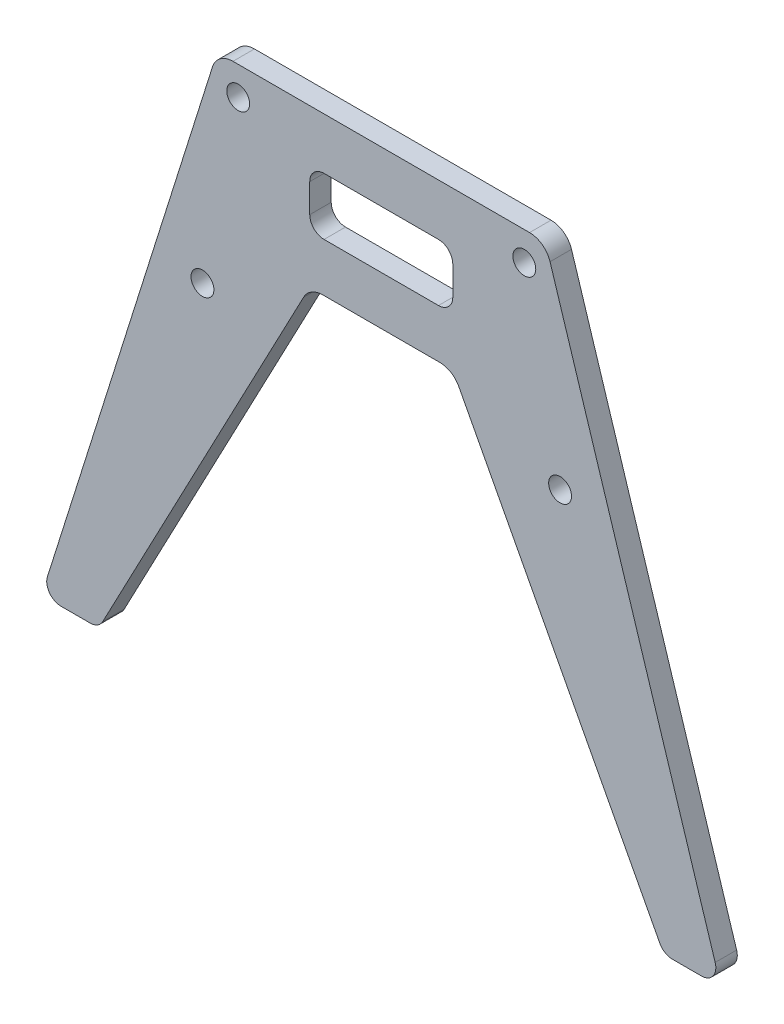
ISO-10303-21;
HEADER;
FILE_DESCRIPTION(('STEP AP214'),'2;1');
FILE_NAME('part.step','',(''),(''),'','','');
FILE_SCHEMA(('AUTOMOTIVE_DESIGN { 1 0 10303 214 1 1 1 1 }'));
ENDSEC;
DATA;
#1=APPLICATION_CONTEXT('core data for automotive mechanical design processes');
#2=APPLICATION_PROTOCOL_DEFINITION('international standard','automotive_design',2000,#1);
#3=PRODUCT_CONTEXT('',#1,'mechanical');
#4=PRODUCT('Part','Part','',(#3));
#5=PRODUCT_RELATED_PRODUCT_CATEGORY('part','',(#4));
#6=PRODUCT_DEFINITION_FORMATION('','',#4);
#7=PRODUCT_DEFINITION_CONTEXT('part definition',#1,'design');
#8=PRODUCT_DEFINITION('design','',#6,#7);
#9=PRODUCT_DEFINITION_SHAPE('','',#8);
#10=(LENGTH_UNIT() NAMED_UNIT(*) SI_UNIT(.MILLI.,.METRE.));
#11=(NAMED_UNIT(*) PLANE_ANGLE_UNIT() SI_UNIT($,.RADIAN.));
#12=(NAMED_UNIT(*) SI_UNIT($,.STERADIAN.) SOLID_ANGLE_UNIT());
#13=UNCERTAINTY_MEASURE_WITH_UNIT(LENGTH_MEASURE(1.E-05),#10,'distance_accuracy_value','');
#14=(GEOMETRIC_REPRESENTATION_CONTEXT(3) GLOBAL_UNCERTAINTY_ASSIGNED_CONTEXT((#13)) GLOBAL_UNIT_ASSIGNED_CONTEXT((#10,
#11,#12)) REPRESENTATION_CONTEXT('',''));
#15=CARTESIAN_POINT('',(0.,0.,0.));
#16=DIRECTION('',(0.,0.,1.));
#17=DIRECTION('',(1.,0.,0.));
#18=AXIS2_PLACEMENT_3D('',#15,#16,#17);
#19=CARTESIAN_POINT('',(0.,0.,3.));
#20=DIRECTION('',(0.,0.,-1.));
#21=DIRECTION('',(-1.,0.,0.));
#22=AXIS2_PLACEMENT_3D('',#19,#20,#21);
#23=PLANE('',#22);
#24=CARTESIAN_POINT('',(-25.,-11.,3.));
#25=DIRECTION('',(0.,0.,1.));
#26=DIRECTION('',(1.,0.,0.));
#27=AXIS2_PLACEMENT_3D('',#24,#25,#26);
#28=CIRCLE('',#27,1.6);
#29=CARTESIAN_POINT('',(-23.4,-11.,3.));
#30=VERTEX_POINT('',#29);
#31=EDGE_CURVE('E522',#30,#30,#28,.T.);
#32=ORIENTED_EDGE('',*,*,#31,.F.);
#33=EDGE_LOOP('',(#32));
#34=FACE_BOUND('',#33,.T.);
#35=CARTESIAN_POINT('',(25.,-11.,3.));
#36=DIRECTION('',(0.,0.,1.));
#37=DIRECTION('',(1.,0.,0.));
#38=AXIS2_PLACEMENT_3D('',#35,#36,#37);
#39=CIRCLE('',#38,1.6);
#40=CARTESIAN_POINT('',(26.6,-11.,3.));
#41=VERTEX_POINT('',#40);
#42=EDGE_CURVE('E523',#41,#41,#39,.T.);
#43=ORIENTED_EDGE('',*,*,#42,.F.);
#44=EDGE_LOOP('',(#43));
#45=FACE_BOUND('',#44,.T.);
#46=DIRECTION('',(1.,0.,0.));
#47=VECTOR('',#46,1.);
#48=CARTESIAN_POINT('',(-10.,2.8,3.));
#49=LINE('',#48,#47);
#50=CARTESIAN_POINT('',(-8.,2.8,3.));
#51=VERTEX_POINT('',#50);
#52=CARTESIAN_POINT('',(8.,2.8,3.));
#53=VERTEX_POINT('',#52);
#54=EDGE_CURVE('E387',#51,#53,#49,.T.);
#55=ORIENTED_EDGE('',*,*,#54,.F.);
#56=CARTESIAN_POINT('',(-8.,4.8,3.));
#57=DIRECTION('',(0.,0.,-1.));
#58=DIRECTION('',(-1.,0.,0.));
#59=AXIS2_PLACEMENT_3D('',#56,#57,#58);
#60=CIRCLE('',#59,2.);
#61=CARTESIAN_POINT('',(-10.,4.8,3.));
#62=VERTEX_POINT('',#61);
#63=EDGE_CURVE('E349',#51,#62,#60,.T.);
#64=ORIENTED_EDGE('',*,*,#63,.T.);
#65=DIRECTION('',(0.,-1.,0.));
#66=VECTOR('',#65,1.);
#67=CARTESIAN_POINT('',(-10.,10.8,3.));
#68=LINE('',#67,#66);
#69=CARTESIAN_POINT('',(-10.,8.8,3.));
#70=VERTEX_POINT('',#69);
#71=EDGE_CURVE('E359',#70,#62,#68,.T.);
#72=ORIENTED_EDGE('',*,*,#71,.F.);
#73=CARTESIAN_POINT('',(-8.,8.8,3.));
#74=DIRECTION('',(0.,0.,-1.));
#75=DIRECTION('',(-1.,0.,0.));
#76=AXIS2_PLACEMENT_3D('',#73,#74,#75);
#77=CIRCLE('',#76,2.);
#78=CARTESIAN_POINT('',(-8.,10.8,3.));
#79=VERTEX_POINT('',#78);
#80=EDGE_CURVE('E49',#70,#79,#77,.T.);
#81=ORIENTED_EDGE('',*,*,#80,.T.);
#82=DIRECTION('',(-1.,0.,0.));
#83=VECTOR('',#82,1.);
#84=CARTESIAN_POINT('',(-10.,10.8,3.));
#85=LINE('',#84,#83);
#86=CARTESIAN_POINT('',(8.,10.8,3.));
#87=VERTEX_POINT('',#86);
#88=EDGE_CURVE('E358',#87,#79,#85,.T.);
#89=ORIENTED_EDGE('',*,*,#88,.F.);
#90=CARTESIAN_POINT('',(8.,8.8,3.));
#91=DIRECTION('',(0.,0.,-1.));
#92=DIRECTION('',(-1.,0.,0.));
#93=AXIS2_PLACEMENT_3D('',#90,#91,#92);
#94=CIRCLE('',#93,2.);
#95=CARTESIAN_POINT('',(10.,8.8,3.));
#96=VERTEX_POINT('',#95);
#97=EDGE_CURVE('E341',#87,#96,#94,.T.);
#98=ORIENTED_EDGE('',*,*,#97,.T.);
#99=DIRECTION('',(0.,1.,0.));
#100=VECTOR('',#99,1.);
#101=CARTESIAN_POINT('',(10.,10.8,3.));
#102=LINE('',#101,#100);
#103=CARTESIAN_POINT('',(10.,4.8,3.));
#104=VERTEX_POINT('',#103);
#105=EDGE_CURVE('E368',#104,#96,#102,.T.);
#106=ORIENTED_EDGE('',*,*,#105,.F.);
#107=CARTESIAN_POINT('',(8.,4.8,3.));
#108=DIRECTION('',(0.,0.,-1.));
#109=DIRECTION('',(-1.,0.,0.));
#110=AXIS2_PLACEMENT_3D('',#107,#108,#109);
#111=CIRCLE('',#110,2.);
#112=EDGE_CURVE('E345',#104,#53,#111,.T.);
#113=ORIENTED_EDGE('',*,*,#112,.T.);
#114=EDGE_LOOP('',(#55,#64,#72,#81,#89,#98,#106,#113));
#115=FACE_BOUND('',#114,.T.);
#116=DIRECTION('',(1.,0.,0.));
#117=VECTOR('',#116,1.);
#118=CARTESIAN_POINT('',(47.5,-60.,3.));
#119=LINE('',#118,#117);
#120=CARTESIAN_POINT('',(40.7069623037807,-60.,3.));
#121=VERTEX_POINT('',#120);
#122=CARTESIAN_POINT('',(44.7732513123354,-60.,3.));
#123=VERTEX_POINT('',#122);
#124=EDGE_CURVE('E414',#121,#123,#119,.T.);
#125=ORIENTED_EDGE('',*,*,#124,.T.);
#126=CARTESIAN_POINT('',(44.7732513123354,-58.,3.));
#127=DIRECTION('',(0.,0.,-1.));
#128=DIRECTION('',(-1.,0.,0.));
#129=AXIS2_PLACEMENT_3D('',#126,#127,#128);
#130=CIRCLE('',#129,2.);
#131=CARTESIAN_POINT('',(46.6808759142368,-57.3991935601042,3.));
#132=VERTEX_POINT('',#131);
#133=EDGE_CURVE('E289',#123,#132,#130,.F.);
#134=ORIENTED_EDGE('',*,*,#133,.T.);
#135=DIRECTION('',(-0.300403219947907,0.953812300950732,0.));
#136=VECTOR('',#135,1.);
#137=CARTESIAN_POINT('',(22.933897075367,18.,3.));
#138=LINE('',#137,#136);
#139=CARTESIAN_POINT('',(23.5949111716939,15.9012096598437,3.));
#140=VERTEX_POINT('',#139);
#141=EDGE_CURVE('E238',#132,#140,#138,.T.);
#142=ORIENTED_EDGE('',*,*,#141,.T.);
#143=CARTESIAN_POINT('',(20.7334742688417,15.,3.));
#144=DIRECTION('',(0.,0.,-1.));
#145=DIRECTION('',(-1.,0.,0.));
#146=AXIS2_PLACEMENT_3D('',#143,#144,#145);
#147=CIRCLE('',#146,3.);
#148=CARTESIAN_POINT('',(20.7334742688417,18.,3.));
#149=VERTEX_POINT('',#148);
#150=EDGE_CURVE('E261',#140,#149,#147,.F.);
#151=ORIENTED_EDGE('',*,*,#150,.T.);
#152=DIRECTION('',(-1.,0.,0.));
#153=VECTOR('',#152,1.);
#154=CARTESIAN_POINT('',(-22.933897075367,18.,3.));
#155=LINE('',#154,#153);
#156=CARTESIAN_POINT('',(-20.7334742688418,18.,3.));
#157=VERTEX_POINT('',#156);
#158=EDGE_CURVE('E222',#149,#157,#155,.T.);
#159=ORIENTED_EDGE('',*,*,#158,.T.);
#160=CARTESIAN_POINT('',(-20.7334742688418,15.,3.));
#161=DIRECTION('',(0.,0.,-1.));
#162=DIRECTION('',(-1.,0.,0.));
#163=AXIS2_PLACEMENT_3D('',#160,#161,#162);
#164=CIRCLE('',#163,3.);
#165=CARTESIAN_POINT('',(-23.594911171694,15.9012096598437,3.));
#166=VERTEX_POINT('',#165);
#167=EDGE_CURVE('E259',#157,#166,#164,.F.);
#168=ORIENTED_EDGE('',*,*,#167,.T.);
#169=DIRECTION('',(-0.300403219947907,-0.953812300950732,0.));
#170=VECTOR('',#169,1.);
#171=CARTESIAN_POINT('',(-22.933897075367,18.,3.));
#172=LINE('',#171,#170);
#173=CARTESIAN_POINT('',(-46.6808759142368,-57.3991935601042,3.));
#174=VERTEX_POINT('',#173);
#175=EDGE_CURVE('E401',#166,#174,#172,.T.);
#176=ORIENTED_EDGE('',*,*,#175,.T.);
#177=CARTESIAN_POINT('',(-44.7732513123354,-58.,3.));
#178=DIRECTION('',(0.,0.,-1.));
#179=DIRECTION('',(-1.,0.,0.));
#180=AXIS2_PLACEMENT_3D('',#177,#178,#179);
#181=CIRCLE('',#180,2.);
#182=CARTESIAN_POINT('',(-44.7732513123354,-60.,3.));
#183=VERTEX_POINT('',#182);
#184=EDGE_CURVE('E283',#174,#183,#181,.F.);
#185=ORIENTED_EDGE('',*,*,#184,.T.);
#186=DIRECTION('',(1.,0.,0.));
#187=VECTOR('',#186,1.);
#188=CARTESIAN_POINT('',(-47.5,-60.,3.));
#189=LINE('',#188,#187);
#190=CARTESIAN_POINT('',(-40.7069623037807,-60.,3.));
#191=VERTEX_POINT('',#190);
#192=EDGE_CURVE('E404',#183,#191,#189,.T.);
#193=ORIENTED_EDGE('',*,*,#192,.T.);
#194=CARTESIAN_POINT('',(-40.7069623037807,-58.,3.));
#195=DIRECTION('',(0.,0.,-1.));
#196=DIRECTION('',(-1.,0.,0.));
#197=AXIS2_PLACEMENT_3D('',#194,#195,#196);
#198=CIRCLE('',#197,2.);
#199=CARTESIAN_POINT('',(-38.937468691386,-58.9321439565294,3.));
#200=VERTEX_POINT('',#199);
#201=EDGE_CURVE('E285',#191,#200,#198,.F.);
#202=ORIENTED_EDGE('',*,*,#201,.T.);
#203=DIRECTION('',(0.466071978264685,0.884746806197368,0.));
#204=VECTOR('',#203,1.);
#205=CARTESIAN_POINT('',(-39.5,-60.,3.));
#206=LINE('',#205,#204);
#207=CARTESIAN_POINT('',(-10.843796962921,-5.60178406520596,3.));
#208=VERTEX_POINT('',#207);
#209=EDGE_CURVE('E407',#200,#208,#206,.T.);
#210=ORIENTED_EDGE('',*,*,#209,.T.);
#211=CARTESIAN_POINT('',(-8.1895565443289,-7.,3.));
#212=DIRECTION('',(0.,0.,-1.));
#213=DIRECTION('',(-1.,0.,0.));
#214=AXIS2_PLACEMENT_3D('',#211,#212,#213);
#215=CIRCLE('',#214,3.);
#216=CARTESIAN_POINT('',(-8.18955654432889,-4.,3.));
#217=VERTEX_POINT('',#216);
#218=EDGE_CURVE('E320',#208,#217,#215,.T.);
#219=ORIENTED_EDGE('',*,*,#218,.T.);
#220=DIRECTION('',(1.,0.,0.));
#221=VECTOR('',#220,1.);
#222=CARTESIAN_POINT('',(10.,-4.00000000000001,3.));
#223=LINE('',#222,#221);
#224=CARTESIAN_POINT('',(8.1895565443289,-4.00000000000001,3.));
#225=VERTEX_POINT('',#224);
#226=EDGE_CURVE('E410',#217,#225,#223,.T.);
#227=ORIENTED_EDGE('',*,*,#226,.T.);
#228=CARTESIAN_POINT('',(8.1895565443289,-7.00000000000001,3.));
#229=DIRECTION('',(0.,0.,-1.));
#230=DIRECTION('',(-1.,0.,0.));
#231=AXIS2_PLACEMENT_3D('',#228,#229,#230);
#232=CIRCLE('',#231,3.);
#233=CARTESIAN_POINT('',(10.843796962921,-5.60178406520595,3.));
#234=VERTEX_POINT('',#233);
#235=EDGE_CURVE('E316',#225,#234,#232,.T.);
#236=ORIENTED_EDGE('',*,*,#235,.T.);
#237=DIRECTION('',(0.466071978264685,-0.884746806197368,0.));
#238=VECTOR('',#237,1.);
#239=CARTESIAN_POINT('',(39.5,-60.,3.));
#240=LINE('',#239,#238);
#241=CARTESIAN_POINT('',(38.937468691386,-58.9321439565294,3.));
#242=VERTEX_POINT('',#241);
#243=EDGE_CURVE('E413',#234,#242,#240,.T.);
#244=ORIENTED_EDGE('',*,*,#243,.T.);
#245=CARTESIAN_POINT('',(40.7069623037807,-58.,3.));
#246=DIRECTION('',(0.,0.,-1.));
#247=DIRECTION('',(-1.,0.,0.));
#248=AXIS2_PLACEMENT_3D('',#245,#246,#247);
#249=CIRCLE('',#248,2.);
#250=EDGE_CURVE('E287',#242,#121,#249,.F.);
#251=ORIENTED_EDGE('',*,*,#250,.T.);
#252=EDGE_LOOP('',(#125,#134,#142,#151,#159,#168,#176,#185,#193,#202,#210,#219,#227,#236,#244,#251));
#253=FACE_BOUND('',#252,.T.);
#254=CARTESIAN_POINT('',(-20.,14.,3.));
#255=DIRECTION('',(0.,0.,1.));
#256=DIRECTION('',(1.,0.,0.));
#257=AXIS2_PLACEMENT_3D('',#254,#255,#256);
#258=CIRCLE('',#257,1.59999999999999);
#259=CARTESIAN_POINT('',(-18.4,14.,3.));
#260=VERTEX_POINT('',#259);
#261=EDGE_CURVE('E229',#260,#260,#258,.T.);
#262=ORIENTED_EDGE('',*,*,#261,.F.);
#263=EDGE_LOOP('',(#262));
#264=FACE_BOUND('',#263,.T.);
#265=CARTESIAN_POINT('',(20.,14.,3.));
#266=DIRECTION('',(0.,0.,1.));
#267=DIRECTION('',(1.,0.,0.));
#268=AXIS2_PLACEMENT_3D('',#265,#266,#267);
#269=CIRCLE('',#268,1.59999999999999);
#270=CARTESIAN_POINT('',(21.6,14.,3.));
#271=VERTEX_POINT('',#270);
#272=EDGE_CURVE('E393',#271,#271,#269,.T.);
#273=ORIENTED_EDGE('',*,*,#272,.F.);
#274=EDGE_LOOP('',(#273));
#275=FACE_BOUND('',#274,.T.);
#276=ADVANCED_FACE('F41',(#34,#45,#115,#253,#264,#275),#23,.F.);
#277=CARTESIAN_POINT('',(0.,0.,0.));
#278=DIRECTION('',(0.,0.,-1.));
#279=DIRECTION('',(-1.,0.,0.));
#280=AXIS2_PLACEMENT_3D('',#277,#278,#279);
#281=PLANE('',#280);
#282=CARTESIAN_POINT('',(-25.,-11.,0.));
#283=DIRECTION('',(0.,0.,1.));
#284=DIRECTION('',(1.,0.,0.));
#285=AXIS2_PLACEMENT_3D('',#282,#283,#284);
#286=CIRCLE('',#285,1.6);
#287=CARTESIAN_POINT('',(-23.4,-11.,0.));
#288=VERTEX_POINT('',#287);
#289=EDGE_CURVE('E388',#288,#288,#286,.T.);
#290=ORIENTED_EDGE('',*,*,#289,.T.);
#291=EDGE_LOOP('',(#290));
#292=FACE_BOUND('',#291,.T.);
#293=CARTESIAN_POINT('',(25.,-11.,0.));
#294=DIRECTION('',(0.,0.,1.));
#295=DIRECTION('',(1.,0.,0.));
#296=AXIS2_PLACEMENT_3D('',#293,#294,#295);
#297=CIRCLE('',#296,1.6);
#298=CARTESIAN_POINT('',(26.6,-11.,0.));
#299=VERTEX_POINT('',#298);
#300=EDGE_CURVE('E378',#299,#299,#297,.T.);
#301=ORIENTED_EDGE('',*,*,#300,.T.);
#302=EDGE_LOOP('',(#301));
#303=FACE_BOUND('',#302,.T.);
#304=DIRECTION('',(-1.,0.,0.));
#305=VECTOR('',#304,1.);
#306=CARTESIAN_POINT('',(-10.,10.8,0.));
#307=LINE('',#306,#305);
#308=CARTESIAN_POINT('',(8.,10.8,0.));
#309=VERTEX_POINT('',#308);
#310=CARTESIAN_POINT('',(-8.,10.8,0.));
#311=VERTEX_POINT('',#310);
#312=EDGE_CURVE('E383',#309,#311,#307,.T.);
#313=ORIENTED_EDGE('',*,*,#312,.T.);
#314=CARTESIAN_POINT('',(-8.,8.8,0.));
#315=DIRECTION('',(0.,0.,-1.));
#316=DIRECTION('',(-1.,0.,0.));
#317=AXIS2_PLACEMENT_3D('',#314,#315,#316);
#318=CIRCLE('',#317,2.);
#319=CARTESIAN_POINT('',(-10.,8.8,0.));
#320=VERTEX_POINT('',#319);
#321=EDGE_CURVE('E11',#311,#320,#318,.F.);
#322=ORIENTED_EDGE('',*,*,#321,.T.);
#323=DIRECTION('',(0.,-1.,0.));
#324=VECTOR('',#323,1.);
#325=CARTESIAN_POINT('',(-10.,10.8,0.));
#326=LINE('',#325,#324);
#327=CARTESIAN_POINT('',(-10.,4.8,0.));
#328=VERTEX_POINT('',#327);
#329=EDGE_CURVE('E367',#320,#328,#326,.T.);
#330=ORIENTED_EDGE('',*,*,#329,.T.);
#331=CARTESIAN_POINT('',(-8.,4.8,0.));
#332=DIRECTION('',(0.,0.,-1.));
#333=DIRECTION('',(-1.,0.,0.));
#334=AXIS2_PLACEMENT_3D('',#331,#332,#333);
#335=CIRCLE('',#334,2.);
#336=CARTESIAN_POINT('',(-8.,2.8,0.));
#337=VERTEX_POINT('',#336);
#338=EDGE_CURVE('E351',#328,#337,#335,.F.);
#339=ORIENTED_EDGE('',*,*,#338,.T.);
#340=DIRECTION('',(1.,0.,0.));
#341=VECTOR('',#340,1.);
#342=CARTESIAN_POINT('',(-10.,2.8,0.));
#343=LINE('',#342,#341);
#344=CARTESIAN_POINT('',(8.,2.8,0.));
#345=VERTEX_POINT('',#344);
#346=EDGE_CURVE('E372',#337,#345,#343,.T.);
#347=ORIENTED_EDGE('',*,*,#346,.T.);
#348=CARTESIAN_POINT('',(8.,4.8,0.));
#349=DIRECTION('',(0.,0.,-1.));
#350=DIRECTION('',(-1.,0.,0.));
#351=AXIS2_PLACEMENT_3D('',#348,#349,#350);
#352=CIRCLE('',#351,2.);
#353=CARTESIAN_POINT('',(10.,4.8,0.));
#354=VERTEX_POINT('',#353);
#355=EDGE_CURVE('E347',#345,#354,#352,.F.);
#356=ORIENTED_EDGE('',*,*,#355,.T.);
#357=DIRECTION('',(0.,1.,0.));
#358=VECTOR('',#357,1.);
#359=CARTESIAN_POINT('',(10.,10.8,0.));
#360=LINE('',#359,#358);
#361=CARTESIAN_POINT('',(10.,8.8,0.));
#362=VERTEX_POINT('',#361);
#363=EDGE_CURVE('E375',#354,#362,#360,.T.);
#364=ORIENTED_EDGE('',*,*,#363,.T.);
#365=CARTESIAN_POINT('',(8.,8.8,0.));
#366=DIRECTION('',(0.,0.,-1.));
#367=DIRECTION('',(-1.,0.,0.));
#368=AXIS2_PLACEMENT_3D('',#365,#366,#367);
#369=CIRCLE('',#368,2.);
#370=EDGE_CURVE('E343',#362,#309,#369,.F.);
#371=ORIENTED_EDGE('',*,*,#370,.T.);
#372=EDGE_LOOP('',(#313,#322,#330,#339,#347,#356,#364,#371));
#373=FACE_BOUND('',#372,.T.);
#374=CARTESIAN_POINT('',(-20.,14.,0.));
#375=DIRECTION('',(0.,0.,1.));
#376=DIRECTION('',(1.,0.,0.));
#377=AXIS2_PLACEMENT_3D('',#374,#375,#376);
#378=CIRCLE('',#377,1.59999999999999);
#379=CARTESIAN_POINT('',(-18.4,14.,0.));
#380=VERTEX_POINT('',#379);
#381=EDGE_CURVE('E235',#380,#380,#378,.T.);
#382=ORIENTED_EDGE('',*,*,#381,.T.);
#383=EDGE_LOOP('',(#382));
#384=FACE_BOUND('',#383,.T.);
#385=DIRECTION('',(-0.300403219947907,0.953812300950732,0.));
#386=VECTOR('',#385,1.);
#387=CARTESIAN_POINT('',(22.933897075367,18.,0.));
#388=LINE('',#387,#386);
#389=CARTESIAN_POINT('',(46.6808759142368,-57.3991935601042,0.));
#390=VERTEX_POINT('',#389);
#391=CARTESIAN_POINT('',(23.5949111716939,15.9012096598437,0.));
#392=VERTEX_POINT('',#391);
#393=EDGE_CURVE('E254',#390,#392,#388,.T.);
#394=ORIENTED_EDGE('',*,*,#393,.F.);
#395=CARTESIAN_POINT('',(44.7732513123354,-58.,0.));
#396=DIRECTION('',(0.,0.,-1.));
#397=DIRECTION('',(-1.,0.,0.));
#398=AXIS2_PLACEMENT_3D('',#395,#396,#397);
#399=CIRCLE('',#398,2.);
#400=CARTESIAN_POINT('',(44.7732513123354,-60.,0.));
#401=VERTEX_POINT('',#400);
#402=EDGE_CURVE('E276',#390,#401,#399,.T.);
#403=ORIENTED_EDGE('',*,*,#402,.T.);
#404=DIRECTION('',(1.,0.,0.));
#405=VECTOR('',#404,1.);
#406=CARTESIAN_POINT('',(47.5,-60.,0.));
#407=LINE('',#406,#405);
#408=CARTESIAN_POINT('',(40.7069623037807,-60.,0.));
#409=VERTEX_POINT('',#408);
#410=EDGE_CURVE('E251',#409,#401,#407,.T.);
#411=ORIENTED_EDGE('',*,*,#410,.F.);
#412=CARTESIAN_POINT('',(40.7069623037807,-58.,0.));
#413=DIRECTION('',(0.,0.,-1.));
#414=DIRECTION('',(-1.,0.,0.));
#415=AXIS2_PLACEMENT_3D('',#412,#413,#414);
#416=CIRCLE('',#415,2.);
#417=CARTESIAN_POINT('',(38.937468691386,-58.9321439565294,0.));
#418=VERTEX_POINT('',#417);
#419=EDGE_CURVE('E273',#409,#418,#416,.T.);
#420=ORIENTED_EDGE('',*,*,#419,.T.);
#421=DIRECTION('',(0.466071978264685,-0.884746806197368,0.));
#422=VECTOR('',#421,1.);
#423=CARTESIAN_POINT('',(39.5,-60.,0.));
#424=LINE('',#423,#422);
#425=CARTESIAN_POINT('',(10.843796962921,-5.60178406520595,0.));
#426=VERTEX_POINT('',#425);
#427=EDGE_CURVE('E249',#426,#418,#424,.T.);
#428=ORIENTED_EDGE('',*,*,#427,.F.);
#429=CARTESIAN_POINT('',(8.1895565443289,-7.00000000000001,0.));
#430=DIRECTION('',(0.,0.,-1.));
#431=DIRECTION('',(-1.,0.,0.));
#432=AXIS2_PLACEMENT_3D('',#429,#430,#431);
#433=CIRCLE('',#432,3.);
#434=CARTESIAN_POINT('',(8.1895565443289,-4.00000000000001,0.));
#435=VERTEX_POINT('',#434);
#436=EDGE_CURVE('E314',#426,#435,#433,.F.);
#437=ORIENTED_EDGE('',*,*,#436,.T.);
#438=DIRECTION('',(1.,0.,0.));
#439=VECTOR('',#438,1.);
#440=CARTESIAN_POINT('',(10.,-4.00000000000001,0.));
#441=LINE('',#440,#439);
#442=CARTESIAN_POINT('',(-8.18955654432889,-4.,0.));
#443=VERTEX_POINT('',#442);
#444=EDGE_CURVE('E246',#443,#435,#441,.T.);
#445=ORIENTED_EDGE('',*,*,#444,.F.);
#446=CARTESIAN_POINT('',(-8.1895565443289,-7.,0.));
#447=DIRECTION('',(0.,0.,-1.));
#448=DIRECTION('',(-1.,0.,0.));
#449=AXIS2_PLACEMENT_3D('',#446,#447,#448);
#450=CIRCLE('',#449,3.);
#451=CARTESIAN_POINT('',(-10.843796962921,-5.60178406520596,0.));
#452=VERTEX_POINT('',#451);
#453=EDGE_CURVE('E318',#443,#452,#450,.F.);
#454=ORIENTED_EDGE('',*,*,#453,.T.);
#455=DIRECTION('',(0.466071978264685,0.884746806197368,0.));
#456=VECTOR('',#455,1.);
#457=CARTESIAN_POINT('',(-39.5,-60.,0.));
#458=LINE('',#457,#456);
#459=CARTESIAN_POINT('',(-38.937468691386,-58.9321439565294,0.));
#460=VERTEX_POINT('',#459);
#461=EDGE_CURVE('E243',#460,#452,#458,.T.);
#462=ORIENTED_EDGE('',*,*,#461,.F.);
#463=CARTESIAN_POINT('',(-40.7069623037807,-58.,0.));
#464=DIRECTION('',(0.,0.,-1.));
#465=DIRECTION('',(-1.,0.,0.));
#466=AXIS2_PLACEMENT_3D('',#463,#464,#465);
#467=CIRCLE('',#466,2.);
#468=CARTESIAN_POINT('',(-40.7069623037807,-60.,0.));
#469=VERTEX_POINT('',#468);
#470=EDGE_CURVE('E271',#460,#469,#467,.T.);
#471=ORIENTED_EDGE('',*,*,#470,.T.);
#472=DIRECTION('',(1.,0.,0.));
#473=VECTOR('',#472,1.);
#474=CARTESIAN_POINT('',(-47.5,-60.,0.));
#475=LINE('',#474,#473);
#476=CARTESIAN_POINT('',(-44.7732513123354,-60.,0.));
#477=VERTEX_POINT('',#476);
#478=EDGE_CURVE('E232',#477,#469,#475,.T.);
#479=ORIENTED_EDGE('',*,*,#478,.F.);
#480=CARTESIAN_POINT('',(-44.7732513123354,-58.,0.));
#481=DIRECTION('',(0.,0.,-1.));
#482=DIRECTION('',(-1.,0.,0.));
#483=AXIS2_PLACEMENT_3D('',#480,#481,#482);
#484=CIRCLE('',#483,2.);
#485=CARTESIAN_POINT('',(-46.6808759142368,-57.3991935601042,0.));
#486=VERTEX_POINT('',#485);
#487=EDGE_CURVE('E269',#477,#486,#484,.T.);
#488=ORIENTED_EDGE('',*,*,#487,.T.);
#489=DIRECTION('',(-0.300403219947907,-0.953812300950732,0.));
#490=VECTOR('',#489,1.);
#491=CARTESIAN_POINT('',(-22.933897075367,18.,0.));
#492=LINE('',#491,#490);
#493=CARTESIAN_POINT('',(-23.594911171694,15.9012096598437,0.));
#494=VERTEX_POINT('',#493);
#495=EDGE_CURVE('E228',#494,#486,#492,.T.);
#496=ORIENTED_EDGE('',*,*,#495,.F.);
#497=CARTESIAN_POINT('',(-20.7334742688418,15.,0.));
#498=DIRECTION('',(0.,0.,-1.));
#499=DIRECTION('',(-1.,0.,0.));
#500=AXIS2_PLACEMENT_3D('',#497,#498,#499);
#501=CIRCLE('',#500,3.);
#502=CARTESIAN_POINT('',(-20.7334742688418,18.,0.));
#503=VERTEX_POINT('',#502);
#504=EDGE_CURVE('E213',#494,#503,#501,.T.);
#505=ORIENTED_EDGE('',*,*,#504,.T.);
#506=DIRECTION('',(-1.,0.,0.));
#507=VECTOR('',#506,1.);
#508=CARTESIAN_POINT('',(-22.933897075367,18.,0.));
#509=LINE('',#508,#507);
#510=CARTESIAN_POINT('',(20.7334742688417,18.,0.));
#511=VERTEX_POINT('',#510);
#512=EDGE_CURVE('E219',#511,#503,#509,.T.);
#513=ORIENTED_EDGE('',*,*,#512,.F.);
#514=CARTESIAN_POINT('',(20.7334742688417,15.,0.));
#515=DIRECTION('',(0.,0.,-1.));
#516=DIRECTION('',(-1.,0.,0.));
#517=AXIS2_PLACEMENT_3D('',#514,#515,#516);
#518=CIRCLE('',#517,3.);
#519=EDGE_CURVE('E203',#511,#392,#518,.T.);
#520=ORIENTED_EDGE('',*,*,#519,.T.);
#521=EDGE_LOOP('',(#394,#403,#411,#420,#428,#437,#445,#454,#462,#471,#479,#488,#496,#505,#513,#520));
#522=FACE_BOUND('',#521,.T.);
#523=CARTESIAN_POINT('',(20.,14.,0.));
#524=DIRECTION('',(0.,0.,1.));
#525=DIRECTION('',(1.,0.,0.));
#526=AXIS2_PLACEMENT_3D('',#523,#524,#525);
#527=CIRCLE('',#526,1.59999999999999);
#528=CARTESIAN_POINT('',(21.6,14.,0.));
#529=VERTEX_POINT('',#528);
#530=EDGE_CURVE('E385',#529,#529,#527,.T.);
#531=ORIENTED_EDGE('',*,*,#530,.T.);
#532=EDGE_LOOP('',(#531));
#533=FACE_BOUND('',#532,.T.);
#534=ADVANCED_FACE('F225',(#292,#303,#373,#384,#522,#533),#281,.T.);
#535=CARTESIAN_POINT('',(-22.933897075367,18.,3.));
#536=DIRECTION('',(0.,-1.,0.));
#537=DIRECTION('',(0.,0.,-1.));
#538=AXIS2_PLACEMENT_3D('',#535,#536,#537);
#539=PLANE('',#538);
#540=ORIENTED_EDGE('',*,*,#158,.F.);
#541=DIRECTION('',(0.,0.,-1.));
#542=VECTOR('',#541,1.);
#543=CARTESIAN_POINT('',(20.7334742688417,18.,3.));
#544=LINE('',#543,#542);
#545=EDGE_CURVE('E207',#149,#511,#544,.T.);
#546=ORIENTED_EDGE('',*,*,#545,.T.);
#547=ORIENTED_EDGE('',*,*,#512,.T.);
#548=DIRECTION('',(0.,0.,-1.));
#549=VECTOR('',#548,1.);
#550=CARTESIAN_POINT('',(-20.7334742688418,18.,3.));
#551=LINE('',#550,#549);
#552=EDGE_CURVE('E223',#503,#157,#551,.F.);
#553=ORIENTED_EDGE('',*,*,#552,.T.);
#554=EDGE_LOOP('',(#540,#546,#547,#553));
#555=FACE_BOUND('',#554,.T.);
#556=ADVANCED_FACE('F218',(#555),#539,.F.);
#557=CARTESIAN_POINT('',(-22.933897075367,18.,3.));
#558=DIRECTION('',(0.953812300950732,-0.300403219947907,0.));
#559=DIRECTION('',(0.300403219947907,0.953812300950732,0.));
#560=AXIS2_PLACEMENT_3D('',#557,#558,#559);
#561=PLANE('',#560);
#562=ORIENTED_EDGE('',*,*,#495,.T.);
#563=DIRECTION('',(0.,0.,-1.));
#564=VECTOR('',#563,1.);
#565=CARTESIAN_POINT('',(-46.6808759142368,-57.3991935601042,3.));
#566=LINE('',#565,#564);
#567=EDGE_CURVE('E302',#486,#174,#566,.F.);
#568=ORIENTED_EDGE('',*,*,#567,.T.);
#569=ORIENTED_EDGE('',*,*,#175,.F.);
#570=DIRECTION('',(0.,0.,-1.));
#571=VECTOR('',#570,1.);
#572=CARTESIAN_POINT('',(-23.594911171694,15.9012096598437,3.));
#573=LINE('',#572,#571);
#574=EDGE_CURVE('E263',#166,#494,#573,.T.);
#575=ORIENTED_EDGE('',*,*,#574,.T.);
#576=EDGE_LOOP('',(#562,#568,#569,#575));
#577=FACE_BOUND('',#576,.T.);
#578=ADVANCED_FACE('F476',(#577),#561,.F.);
#579=CARTESIAN_POINT('',(-47.5,-60.,3.));
#580=DIRECTION('',(0.,1.,0.));
#581=DIRECTION('',(0.,0.,1.));
#582=AXIS2_PLACEMENT_3D('',#579,#580,#581);
#583=PLANE('',#582);
#584=ORIENTED_EDGE('',*,*,#478,.T.);
#585=DIRECTION('',(0.,0.,-1.));
#586=VECTOR('',#585,1.);
#587=CARTESIAN_POINT('',(-40.7069623037807,-60.,3.));
#588=LINE('',#587,#586);
#589=EDGE_CURVE('E300',#469,#191,#588,.F.);
#590=ORIENTED_EDGE('',*,*,#589,.T.);
#591=ORIENTED_EDGE('',*,*,#192,.F.);
#592=DIRECTION('',(0.,0.,-1.));
#593=VECTOR('',#592,1.);
#594=CARTESIAN_POINT('',(-44.7732513123354,-60.,3.));
#595=LINE('',#594,#593);
#596=EDGE_CURVE('E297',#183,#477,#595,.T.);
#597=ORIENTED_EDGE('',*,*,#596,.T.);
#598=EDGE_LOOP('',(#584,#590,#591,#597));
#599=FACE_BOUND('',#598,.T.);
#600=ADVANCED_FACE('F472',(#599),#583,.F.);
#601=CARTESIAN_POINT('',(-39.5,-60.,3.));
#602=DIRECTION('',(-0.884746806197368,0.466071978264685,0.));
#603=DIRECTION('',(-0.466071978264685,-0.884746806197368,0.));
#604=AXIS2_PLACEMENT_3D('',#601,#602,#603);
#605=PLANE('',#604);
#606=ORIENTED_EDGE('',*,*,#461,.T.);
#607=DIRECTION('',(0.,0.,-1.));
#608=VECTOR('',#607,1.);
#609=CARTESIAN_POINT('',(-10.843796962921,-5.60178406520595,3.));
#610=LINE('',#609,#608);
#611=EDGE_CURVE('E312',#452,#208,#610,.F.);
#612=ORIENTED_EDGE('',*,*,#611,.T.);
#613=ORIENTED_EDGE('',*,*,#209,.F.);
#614=DIRECTION('',(0.,0.,-1.));
#615=VECTOR('',#614,1.);
#616=CARTESIAN_POINT('',(-38.937468691386,-58.9321439565294,3.));
#617=LINE('',#616,#615);
#618=EDGE_CURVE('E294',#200,#460,#617,.T.);
#619=ORIENTED_EDGE('',*,*,#618,.T.);
#620=EDGE_LOOP('',(#606,#612,#613,#619));
#621=FACE_BOUND('',#620,.T.);
#622=ADVANCED_FACE('F468',(#621),#605,.F.);
#623=CARTESIAN_POINT('',(10.,-4.00000000000001,3.));
#624=DIRECTION('',(0.,1.,0.));
#625=DIRECTION('',(-1.,0.,0.));
#626=AXIS2_PLACEMENT_3D('',#623,#624,#625);
#627=PLANE('',#626);
#628=ORIENTED_EDGE('',*,*,#444,.T.);
#629=DIRECTION('',(0.,0.,-1.));
#630=VECTOR('',#629,1.);
#631=CARTESIAN_POINT('',(8.1895565443289,-4.00000000000001,3.));
#632=LINE('',#631,#630);
#633=EDGE_CURVE('E310',#435,#225,#632,.F.);
#634=ORIENTED_EDGE('',*,*,#633,.T.);
#635=ORIENTED_EDGE('',*,*,#226,.F.);
#636=DIRECTION('',(0.,0.,-1.));
#637=VECTOR('',#636,1.);
#638=CARTESIAN_POINT('',(-8.18955654432889,-4.,0.));
#639=LINE('',#638,#637);
#640=EDGE_CURVE('E307',#217,#443,#639,.T.);
#641=ORIENTED_EDGE('',*,*,#640,.T.);
#642=EDGE_LOOP('',(#628,#634,#635,#641));
#643=FACE_BOUND('',#642,.T.);
#644=ADVANCED_FACE('F464',(#643),#627,.F.);
#645=CARTESIAN_POINT('',(39.5,-60.,3.));
#646=DIRECTION('',(0.884746806197368,0.466071978264685,0.));
#647=DIRECTION('',(-0.466071978264685,0.884746806197368,0.));
#648=AXIS2_PLACEMENT_3D('',#645,#646,#647);
#649=PLANE('',#648);
#650=ORIENTED_EDGE('',*,*,#243,.F.);
#651=DIRECTION('',(0.,0.,-1.));
#652=VECTOR('',#651,1.);
#653=CARTESIAN_POINT('',(10.843796962921,-5.60178406520596,0.));
#654=LINE('',#653,#652);
#655=EDGE_CURVE('E304',#234,#426,#654,.T.);
#656=ORIENTED_EDGE('',*,*,#655,.T.);
#657=ORIENTED_EDGE('',*,*,#427,.T.);
#658=DIRECTION('',(0.,0.,-1.));
#659=VECTOR('',#658,1.);
#660=CARTESIAN_POINT('',(38.937468691386,-58.9321439565294,3.));
#661=LINE('',#660,#659);
#662=EDGE_CURVE('E291',#418,#242,#661,.F.);
#663=ORIENTED_EDGE('',*,*,#662,.T.);
#664=EDGE_LOOP('',(#650,#656,#657,#663));
#665=FACE_BOUND('',#664,.T.);
#666=ADVANCED_FACE('F461',(#665),#649,.F.);
#667=CARTESIAN_POINT('',(47.5,-60.,3.));
#668=DIRECTION('',(0.,1.,0.));
#669=DIRECTION('',(0.,0.,1.));
#670=AXIS2_PLACEMENT_3D('',#667,#668,#669);
#671=PLANE('',#670);
#672=ORIENTED_EDGE('',*,*,#410,.T.);
#673=DIRECTION('',(0.,0.,-1.));
#674=VECTOR('',#673,1.);
#675=CARTESIAN_POINT('',(44.7732513123354,-60.,3.));
#676=LINE('',#675,#674);
#677=EDGE_CURVE('E281',#401,#123,#676,.F.);
#678=ORIENTED_EDGE('',*,*,#677,.T.);
#679=ORIENTED_EDGE('',*,*,#124,.F.);
#680=DIRECTION('',(0.,0.,-1.));
#681=VECTOR('',#680,1.);
#682=CARTESIAN_POINT('',(40.7069623037807,-60.,3.));
#683=LINE('',#682,#681);
#684=EDGE_CURVE('E278',#121,#409,#683,.T.);
#685=ORIENTED_EDGE('',*,*,#684,.T.);
#686=EDGE_LOOP('',(#672,#678,#679,#685));
#687=FACE_BOUND('',#686,.T.);
#688=ADVANCED_FACE('F427',(#687),#671,.F.);
#689=CARTESIAN_POINT('',(22.933897075367,18.,3.));
#690=DIRECTION('',(-0.953812300950732,-0.300403219947907,0.));
#691=DIRECTION('',(0.300403219947907,-0.953812300950732,0.));
#692=AXIS2_PLACEMENT_3D('',#689,#690,#691);
#693=PLANE('',#692);
#694=ORIENTED_EDGE('',*,*,#141,.F.);
#695=DIRECTION('',(0.,0.,-1.));
#696=VECTOR('',#695,1.);
#697=CARTESIAN_POINT('',(46.6808759142368,-57.3991935601042,3.));
#698=LINE('',#697,#696);
#699=EDGE_CURVE('E266',#132,#390,#698,.T.);
#700=ORIENTED_EDGE('',*,*,#699,.T.);
#701=ORIENTED_EDGE('',*,*,#393,.T.);
#702=DIRECTION('',(0.,0.,-1.));
#703=VECTOR('',#702,1.);
#704=CARTESIAN_POINT('',(23.5949111716939,15.9012096598437,3.));
#705=LINE('',#704,#703);
#706=EDGE_CURVE('E209',#392,#140,#705,.F.);
#707=ORIENTED_EDGE('',*,*,#706,.T.);
#708=EDGE_LOOP('',(#694,#700,#701,#707));
#709=FACE_BOUND('',#708,.T.);
#710=ADVANCED_FACE('F422',(#709),#693,.F.);
#711=CARTESIAN_POINT('',(-20.,14.,3.));
#712=DIRECTION('',(0.,0.,-1.));
#713=DIRECTION('',(-1.,0.,0.));
#714=AXIS2_PLACEMENT_3D('',#711,#712,#713);
#715=CYLINDRICAL_SURFACE('',#714,1.59999999999999);
#716=ORIENTED_EDGE('',*,*,#261,.T.);
#717=EDGE_LOOP('',(#716));
#718=FACE_BOUND('',#717,.T.);
#719=ORIENTED_EDGE('',*,*,#381,.F.);
#720=EDGE_LOOP('',(#719));
#721=FACE_BOUND('',#720,.T.);
#722=ADVANCED_FACE('F454',(#718,#721),#715,.F.);
#723=CARTESIAN_POINT('',(20.,14.,3.));
#724=DIRECTION('',(0.,0.,-1.));
#725=DIRECTION('',(-1.,0.,0.));
#726=AXIS2_PLACEMENT_3D('',#723,#724,#725);
#727=CYLINDRICAL_SURFACE('',#726,1.59999999999999);
#728=ORIENTED_EDGE('',*,*,#272,.T.);
#729=EDGE_LOOP('',(#728));
#730=FACE_BOUND('',#729,.T.);
#731=ORIENTED_EDGE('',*,*,#530,.F.);
#732=EDGE_LOOP('',(#731));
#733=FACE_BOUND('',#732,.T.);
#734=ADVANCED_FACE('F484',(#730,#733),#727,.F.);
#735=CARTESIAN_POINT('',(20.7334742688417,15.,3.));
#736=DIRECTION('',(0.,0.,-1.));
#737=DIRECTION('',(-1.,0.,0.));
#738=AXIS2_PLACEMENT_3D('',#735,#736,#737);
#739=CYLINDRICAL_SURFACE('',#738,3.);
#740=ORIENTED_EDGE('',*,*,#150,.F.);
#741=ORIENTED_EDGE('',*,*,#706,.F.);
#742=ORIENTED_EDGE('',*,*,#519,.F.);
#743=ORIENTED_EDGE('',*,*,#545,.F.);
#744=EDGE_LOOP('',(#740,#741,#742,#743));
#745=FACE_BOUND('',#744,.T.);
#746=ADVANCED_FACE('F206',(#745),#739,.T.);
#747=CARTESIAN_POINT('',(-20.7334742688418,15.,3.));
#748=DIRECTION('',(0.,0.,-1.));
#749=DIRECTION('',(-1.,0.,0.));
#750=AXIS2_PLACEMENT_3D('',#747,#748,#749);
#751=CYLINDRICAL_SURFACE('',#750,3.);
#752=ORIENTED_EDGE('',*,*,#167,.F.);
#753=ORIENTED_EDGE('',*,*,#552,.F.);
#754=ORIENTED_EDGE('',*,*,#504,.F.);
#755=ORIENTED_EDGE('',*,*,#574,.F.);
#756=EDGE_LOOP('',(#752,#753,#754,#755));
#757=FACE_BOUND('',#756,.T.);
#758=ADVANCED_FACE('F432',(#757),#751,.T.);
#759=CARTESIAN_POINT('',(44.7732513123354,-58.,3.));
#760=DIRECTION('',(0.,0.,-1.));
#761=DIRECTION('',(-1.,0.,0.));
#762=AXIS2_PLACEMENT_3D('',#759,#760,#761);
#763=CYLINDRICAL_SURFACE('',#762,2.);
#764=ORIENTED_EDGE('',*,*,#133,.F.);
#765=ORIENTED_EDGE('',*,*,#677,.F.);
#766=ORIENTED_EDGE('',*,*,#402,.F.);
#767=ORIENTED_EDGE('',*,*,#699,.F.);
#768=EDGE_LOOP('',(#764,#765,#766,#767));
#769=FACE_BOUND('',#768,.T.);
#770=ADVANCED_FACE('F429',(#769),#763,.T.);
#771=CARTESIAN_POINT('',(40.7069623037807,-58.,3.));
#772=DIRECTION('',(0.,0.,-1.));
#773=DIRECTION('',(-1.,0.,0.));
#774=AXIS2_PLACEMENT_3D('',#771,#772,#773);
#775=CYLINDRICAL_SURFACE('',#774,2.);
#776=ORIENTED_EDGE('',*,*,#250,.F.);
#777=ORIENTED_EDGE('',*,*,#662,.F.);
#778=ORIENTED_EDGE('',*,*,#419,.F.);
#779=ORIENTED_EDGE('',*,*,#684,.F.);
#780=EDGE_LOOP('',(#776,#777,#778,#779));
#781=FACE_BOUND('',#780,.T.);
#782=ADVANCED_FACE('F431',(#781),#775,.T.);
#783=CARTESIAN_POINT('',(-40.7069623037807,-58.,3.));
#784=DIRECTION('',(0.,0.,-1.));
#785=DIRECTION('',(-1.,0.,0.));
#786=AXIS2_PLACEMENT_3D('',#783,#784,#785);
#787=CYLINDRICAL_SURFACE('',#786,2.);
#788=ORIENTED_EDGE('',*,*,#201,.F.);
#789=ORIENTED_EDGE('',*,*,#589,.F.);
#790=ORIENTED_EDGE('',*,*,#470,.F.);
#791=ORIENTED_EDGE('',*,*,#618,.F.);
#792=EDGE_LOOP('',(#788,#789,#790,#791));
#793=FACE_BOUND('',#792,.T.);
#794=ADVANCED_FACE('F438',(#793),#787,.T.);
#795=CARTESIAN_POINT('',(-44.7732513123354,-58.,3.));
#796=DIRECTION('',(0.,0.,-1.));
#797=DIRECTION('',(-1.,0.,0.));
#798=AXIS2_PLACEMENT_3D('',#795,#796,#797);
#799=CYLINDRICAL_SURFACE('',#798,2.);
#800=ORIENTED_EDGE('',*,*,#184,.F.);
#801=ORIENTED_EDGE('',*,*,#567,.F.);
#802=ORIENTED_EDGE('',*,*,#487,.F.);
#803=ORIENTED_EDGE('',*,*,#596,.F.);
#804=EDGE_LOOP('',(#800,#801,#802,#803));
#805=FACE_BOUND('',#804,.T.);
#806=ADVANCED_FACE('F564',(#805),#799,.T.);
#807=CARTESIAN_POINT('',(8.1895565443289,-7.00000000000001,3.));
#808=DIRECTION('',(0.,0.,1.));
#809=DIRECTION('',(1.,0.,0.));
#810=AXIS2_PLACEMENT_3D('',#807,#808,#809);
#811=CYLINDRICAL_SURFACE('',#810,3.);
#812=ORIENTED_EDGE('',*,*,#235,.F.);
#813=ORIENTED_EDGE('',*,*,#633,.F.);
#814=ORIENTED_EDGE('',*,*,#436,.F.);
#815=ORIENTED_EDGE('',*,*,#655,.F.);
#816=EDGE_LOOP('',(#812,#813,#814,#815));
#817=FACE_BOUND('',#816,.T.);
#818=ADVANCED_FACE('F560',(#817),#811,.F.);
#819=CARTESIAN_POINT('',(-8.1895565443289,-7.,3.));
#820=DIRECTION('',(0.,0.,1.));
#821=DIRECTION('',(1.,0.,0.));
#822=AXIS2_PLACEMENT_3D('',#819,#820,#821);
#823=CYLINDRICAL_SURFACE('',#822,3.);
#824=ORIENTED_EDGE('',*,*,#218,.F.);
#825=ORIENTED_EDGE('',*,*,#611,.F.);
#826=ORIENTED_EDGE('',*,*,#453,.F.);
#827=ORIENTED_EDGE('',*,*,#640,.F.);
#828=EDGE_LOOP('',(#824,#825,#826,#827));
#829=FACE_BOUND('',#828,.T.);
#830=ADVANCED_FACE('F497',(#829),#823,.F.);
#831=CARTESIAN_POINT('',(-10.,10.8,0.));
#832=DIRECTION('',(-1.,0.,0.));
#833=DIRECTION('',(0.,-1.,0.));
#834=AXIS2_PLACEMENT_3D('',#831,#832,#833);
#835=PLANE('',#834);
#836=ORIENTED_EDGE('',*,*,#71,.T.);
#837=DIRECTION('',(0.,0.,1.));
#838=VECTOR('',#837,1.);
#839=CARTESIAN_POINT('',(-10.,4.8,0.));
#840=LINE('',#839,#838);
#841=EDGE_CURVE('E56',#62,#328,#840,.F.);
#842=ORIENTED_EDGE('',*,*,#841,.T.);
#843=ORIENTED_EDGE('',*,*,#329,.F.);
#844=DIRECTION('',(0.,0.,1.));
#845=VECTOR('',#844,1.);
#846=CARTESIAN_POINT('',(-10.,8.8,3.));
#847=LINE('',#846,#845);
#848=EDGE_CURVE('E337',#320,#70,#847,.T.);
#849=ORIENTED_EDGE('',*,*,#848,.T.);
#850=EDGE_LOOP('',(#836,#842,#843,#849));
#851=FACE_BOUND('',#850,.T.);
#852=ADVANCED_FACE('F370',(#851),#835,.F.);
#853=CARTESIAN_POINT('',(-10.,10.8,0.));
#854=DIRECTION('',(0.,1.,0.));
#855=DIRECTION('',(0.,0.,1.));
#856=AXIS2_PLACEMENT_3D('',#853,#854,#855);
#857=PLANE('',#856);
#858=ORIENTED_EDGE('',*,*,#312,.F.);
#859=DIRECTION('',(0.,0.,1.));
#860=VECTOR('',#859,1.);
#861=CARTESIAN_POINT('',(8.,10.8,3.));
#862=LINE('',#861,#860);
#863=EDGE_CURVE('E324',#309,#87,#862,.T.);
#864=ORIENTED_EDGE('',*,*,#863,.T.);
#865=ORIENTED_EDGE('',*,*,#88,.T.);
#866=DIRECTION('',(0.,0.,1.));
#867=VECTOR('',#866,1.);
#868=CARTESIAN_POINT('',(-8.,10.8,0.));
#869=LINE('',#868,#867);
#870=EDGE_CURVE('E322',#79,#311,#869,.F.);
#871=ORIENTED_EDGE('',*,*,#870,.T.);
#872=EDGE_LOOP('',(#858,#864,#865,#871));
#873=FACE_BOUND('',#872,.T.);
#874=ADVANCED_FACE('F365',(#873),#857,.F.);
#875=CARTESIAN_POINT('',(10.,10.8,0.));
#876=DIRECTION('',(1.,0.,0.));
#877=DIRECTION('',(0.,1.,0.));
#878=AXIS2_PLACEMENT_3D('',#875,#876,#877);
#879=PLANE('',#878);
#880=ORIENTED_EDGE('',*,*,#105,.T.);
#881=DIRECTION('',(0.,0.,1.));
#882=VECTOR('',#881,1.);
#883=CARTESIAN_POINT('',(10.,8.8,0.));
#884=LINE('',#883,#882);
#885=EDGE_CURVE('E330',#96,#362,#884,.F.);
#886=ORIENTED_EDGE('',*,*,#885,.T.);
#887=ORIENTED_EDGE('',*,*,#363,.F.);
#888=DIRECTION('',(0.,0.,1.));
#889=VECTOR('',#888,1.);
#890=CARTESIAN_POINT('',(10.,4.8,3.));
#891=LINE('',#890,#889);
#892=EDGE_CURVE('E327',#354,#104,#891,.T.);
#893=ORIENTED_EDGE('',*,*,#892,.T.);
#894=EDGE_LOOP('',(#880,#886,#887,#893));
#895=FACE_BOUND('',#894,.T.);
#896=ADVANCED_FACE('F502',(#895),#879,.F.);
#897=CARTESIAN_POINT('',(-10.,2.8,0.));
#898=DIRECTION('',(0.,-1.,0.));
#899=DIRECTION('',(1.,0.,0.));
#900=AXIS2_PLACEMENT_3D('',#897,#898,#899);
#901=PLANE('',#900);
#902=ORIENTED_EDGE('',*,*,#54,.T.);
#903=DIRECTION('',(0.,0.,1.));
#904=VECTOR('',#903,1.);
#905=CARTESIAN_POINT('',(8.,2.8,0.));
#906=LINE('',#905,#904);
#907=EDGE_CURVE('E335',#53,#345,#906,.F.);
#908=ORIENTED_EDGE('',*,*,#907,.T.);
#909=ORIENTED_EDGE('',*,*,#346,.F.);
#910=DIRECTION('',(0.,0.,1.));
#911=VECTOR('',#910,1.);
#912=CARTESIAN_POINT('',(-8.,2.8,3.));
#913=LINE('',#912,#911);
#914=EDGE_CURVE('E332',#337,#51,#913,.T.);
#915=ORIENTED_EDGE('',*,*,#914,.T.);
#916=EDGE_LOOP('',(#902,#908,#909,#915));
#917=FACE_BOUND('',#916,.T.);
#918=ADVANCED_FACE('F498',(#917),#901,.F.);
#919=CARTESIAN_POINT('',(8.,8.8,0.));
#920=DIRECTION('',(0.,0.,-1.));
#921=DIRECTION('',(-1.,0.,0.));
#922=AXIS2_PLACEMENT_3D('',#919,#920,#921);
#923=CYLINDRICAL_SURFACE('',#922,2.);
#924=ORIENTED_EDGE('',*,*,#370,.F.);
#925=ORIENTED_EDGE('',*,*,#885,.F.);
#926=ORIENTED_EDGE('',*,*,#97,.F.);
#927=ORIENTED_EDGE('',*,*,#863,.F.);
#928=EDGE_LOOP('',(#924,#925,#926,#927));
#929=FACE_BOUND('',#928,.T.);
#930=ADVANCED_FACE('F501',(#929),#923,.F.);
#931=CARTESIAN_POINT('',(8.,4.8,0.));
#932=DIRECTION('',(0.,0.,-1.));
#933=DIRECTION('',(-1.,0.,0.));
#934=AXIS2_PLACEMENT_3D('',#931,#932,#933);
#935=CYLINDRICAL_SURFACE('',#934,2.);
#936=ORIENTED_EDGE('',*,*,#355,.F.);
#937=ORIENTED_EDGE('',*,*,#907,.F.);
#938=ORIENTED_EDGE('',*,*,#112,.F.);
#939=ORIENTED_EDGE('',*,*,#892,.F.);
#940=EDGE_LOOP('',(#936,#937,#938,#939));
#941=FACE_BOUND('',#940,.T.);
#942=ADVANCED_FACE('F543',(#941),#935,.F.);
#943=CARTESIAN_POINT('',(-8.,4.8,0.));
#944=DIRECTION('',(0.,0.,-1.));
#945=DIRECTION('',(-1.,0.,0.));
#946=AXIS2_PLACEMENT_3D('',#943,#944,#945);
#947=CYLINDRICAL_SURFACE('',#946,2.);
#948=ORIENTED_EDGE('',*,*,#338,.F.);
#949=ORIENTED_EDGE('',*,*,#841,.F.);
#950=ORIENTED_EDGE('',*,*,#63,.F.);
#951=ORIENTED_EDGE('',*,*,#914,.F.);
#952=EDGE_LOOP('',(#948,#949,#950,#951));
#953=FACE_BOUND('',#952,.T.);
#954=ADVANCED_FACE('F548',(#953),#947,.F.);
#955=CARTESIAN_POINT('',(-8.,8.8,0.));
#956=DIRECTION('',(0.,0.,-1.));
#957=DIRECTION('',(-1.,0.,0.));
#958=AXIS2_PLACEMENT_3D('',#955,#956,#957);
#959=CYLINDRICAL_SURFACE('',#958,2.);
#960=ORIENTED_EDGE('',*,*,#321,.F.);
#961=ORIENTED_EDGE('',*,*,#870,.F.);
#962=ORIENTED_EDGE('',*,*,#80,.F.);
#963=ORIENTED_EDGE('',*,*,#848,.F.);
#964=EDGE_LOOP('',(#960,#961,#962,#963));
#965=FACE_BOUND('',#964,.T.);
#966=ADVANCED_FACE('F43',(#965),#959,.F.);
#967=CARTESIAN_POINT('',(25.,-11.,0.));
#968=DIRECTION('',(0.,0.,1.));
#969=DIRECTION('',(1.,0.,0.));
#970=AXIS2_PLACEMENT_3D('',#967,#968,#969);
#971=CYLINDRICAL_SURFACE('',#970,1.6);
#972=ORIENTED_EDGE('',*,*,#300,.F.);
#973=EDGE_LOOP('',(#972));
#974=FACE_BOUND('',#973,.T.);
#975=ORIENTED_EDGE('',*,*,#42,.T.);
#976=EDGE_LOOP('',(#975));
#977=FACE_BOUND('',#976,.T.);
#978=ADVANCED_FACE('F509',(#974,#977),#971,.F.);
#979=CARTESIAN_POINT('',(-25.,-11.,0.));
#980=DIRECTION('',(0.,0.,1.));
#981=DIRECTION('',(1.,0.,0.));
#982=AXIS2_PLACEMENT_3D('',#979,#980,#981);
#983=CYLINDRICAL_SURFACE('',#982,1.6);
#984=ORIENTED_EDGE('',*,*,#289,.F.);
#985=EDGE_LOOP('',(#984));
#986=FACE_BOUND('',#985,.T.);
#987=ORIENTED_EDGE('',*,*,#31,.T.);
#988=EDGE_LOOP('',(#987));
#989=FACE_BOUND('',#988,.T.);
#990=ADVANCED_FACE('F512',(#986,#989),#983,.F.);
#991=CLOSED_SHELL('',(#276,#534,#556,#578,#600,#622,#644,#666,#688,#710,#722,#734,#746,#758,
#770,#782,#794,#806,#818,#830,#852,#874,#896,#918,#930,#942,#954,#966,#978,#990));
#992=MANIFOLD_SOLID_BREP('B2',#991);
#993=ADVANCED_BREP_SHAPE_REPRESENTATION('',(#18,#992),#14);
#994=SHAPE_DEFINITION_REPRESENTATION(#9,#993);
ENDSEC;
END-ISO-10303-21;
